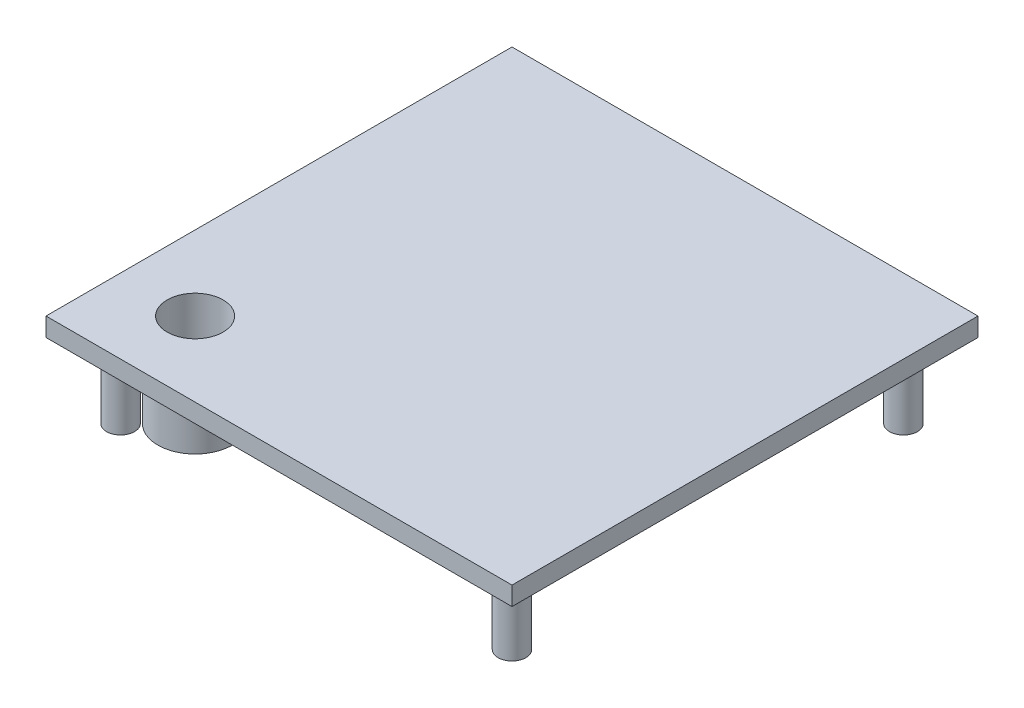
ISO-10303-21;
HEADER;
FILE_DESCRIPTION(('STEP AP214'),'2;1');
FILE_NAME('part.step','',(''),(''),'','','');
FILE_SCHEMA(('AUTOMOTIVE_DESIGN { 1 0 10303 214 1 1 1 1 }'));
ENDSEC;
DATA;
#1=APPLICATION_CONTEXT('core data for automotive mechanical design processes');
#2=APPLICATION_PROTOCOL_DEFINITION('international standard','automotive_design',2000,#1);
#3=PRODUCT_CONTEXT('',#1,'mechanical');
#4=PRODUCT('Part','Part','',(#3));
#5=PRODUCT_RELATED_PRODUCT_CATEGORY('part','',(#4));
#6=PRODUCT_DEFINITION_FORMATION('','',#4);
#7=PRODUCT_DEFINITION_CONTEXT('part definition',#1,'design');
#8=PRODUCT_DEFINITION('design','',#6,#7);
#9=PRODUCT_DEFINITION_SHAPE('','',#8);
#10=(LENGTH_UNIT() NAMED_UNIT(*) SI_UNIT(.MILLI.,.METRE.));
#11=(NAMED_UNIT(*) PLANE_ANGLE_UNIT() SI_UNIT($,.RADIAN.));
#12=(NAMED_UNIT(*) SI_UNIT($,.STERADIAN.) SOLID_ANGLE_UNIT());
#13=UNCERTAINTY_MEASURE_WITH_UNIT(LENGTH_MEASURE(1.E-05),#10,'distance_accuracy_value','');
#14=(GEOMETRIC_REPRESENTATION_CONTEXT(3) GLOBAL_UNCERTAINTY_ASSIGNED_CONTEXT((#13)) GLOBAL_UNIT_ASSIGNED_CONTEXT((#10,
#11,#12)) REPRESENTATION_CONTEXT('',''));
#15=CARTESIAN_POINT('',(0.,0.,0.));
#16=DIRECTION('',(0.,0.,1.));
#17=DIRECTION('',(1.,0.,0.));
#18=AXIS2_PLACEMENT_3D('',#15,#16,#17);
#19=CARTESIAN_POINT('',(0.,0.,0.));
#20=DIRECTION('',(0.,-1.,0.));
#21=DIRECTION('',(0.,0.,-1.));
#22=AXIS2_PLACEMENT_3D('',#19,#20,#21);
#23=PLANE('',#22);
#24=CARTESIAN_POINT('',(-21.,0.,-21.));
#25=DIRECTION('',(0.,-1.,0.));
#26=DIRECTION('',(0.,0.,-1.));
#27=AXIS2_PLACEMENT_3D('',#24,#25,#26);
#28=CIRCLE('',#27,1.5);
#29=CARTESIAN_POINT('',(-21.,0.,-22.5));
#30=VERTEX_POINT('',#29);
#31=EDGE_CURVE('E12',#30,#30,#28,.T.);
#32=ORIENTED_EDGE('',*,*,#31,.F.);
#33=EDGE_LOOP('',(#32));
#34=FACE_BOUND('',#33,.T.);
#35=CARTESIAN_POINT('',(21.,0.,-21.));
#36=DIRECTION('',(0.,-1.,0.));
#37=DIRECTION('',(0.,0.,-1.));
#38=AXIS2_PLACEMENT_3D('',#35,#36,#37);
#39=CIRCLE('',#38,1.5);
#40=CARTESIAN_POINT('',(21.,0.,-22.5));
#41=VERTEX_POINT('',#40);
#42=EDGE_CURVE('E57',#41,#41,#39,.T.);
#43=ORIENTED_EDGE('',*,*,#42,.F.);
#44=EDGE_LOOP('',(#43));
#45=FACE_BOUND('',#44,.T.);
#46=CARTESIAN_POINT('',(21.,0.,21.));
#47=DIRECTION('',(0.,-1.,0.));
#48=DIRECTION('',(0.,0.,-1.));
#49=AXIS2_PLACEMENT_3D('',#46,#47,#48);
#50=CIRCLE('',#49,1.5);
#51=CARTESIAN_POINT('',(21.,0.,19.5));
#52=VERTEX_POINT('',#51);
#53=EDGE_CURVE('E331',#52,#52,#50,.T.);
#54=ORIENTED_EDGE('',*,*,#53,.F.);
#55=EDGE_LOOP('',(#54));
#56=FACE_BOUND('',#55,.T.);
#57=CARTESIAN_POINT('',(-21.,0.,21.));
#58=DIRECTION('',(0.,-1.,0.));
#59=DIRECTION('',(0.,0.,-1.));
#60=AXIS2_PLACEMENT_3D('',#57,#58,#59);
#61=CIRCLE('',#60,1.5);
#62=CARTESIAN_POINT('',(-21.,0.,19.5));
#63=VERTEX_POINT('',#62);
#64=EDGE_CURVE('E327',#63,#63,#61,.T.);
#65=ORIENTED_EDGE('',*,*,#64,.F.);
#66=EDGE_LOOP('',(#65));
#67=FACE_BOUND('',#66,.T.);
#68=DIRECTION('',(0.,0.,-1.));
#69=VECTOR('',#68,1.);
#70=CARTESIAN_POINT('',(25.,0.,25.));
#71=LINE('',#70,#69);
#72=CARTESIAN_POINT('',(25.,0.,25.));
#73=VERTEX_POINT('',#72);
#74=CARTESIAN_POINT('',(25.,0.,-25.));
#75=VERTEX_POINT('',#74);
#76=EDGE_CURVE('E282',#73,#75,#71,.T.);
#77=ORIENTED_EDGE('',*,*,#76,.F.);
#78=DIRECTION('',(1.,0.,0.));
#79=VECTOR('',#78,1.);
#80=CARTESIAN_POINT('',(-25.,0.,25.));
#81=LINE('',#80,#79);
#82=CARTESIAN_POINT('',(-25.,0.,25.));
#83=VERTEX_POINT('',#82);
#84=EDGE_CURVE('E89',#83,#73,#81,.T.);
#85=ORIENTED_EDGE('',*,*,#84,.F.);
#86=DIRECTION('',(0.,0.,1.));
#87=VECTOR('',#86,1.);
#88=CARTESIAN_POINT('',(-25.,0.,25.));
#89=LINE('',#88,#87);
#90=CARTESIAN_POINT('',(-25.,0.,-25.));
#91=VERTEX_POINT('',#90);
#92=EDGE_CURVE('E83',#91,#83,#89,.T.);
#93=ORIENTED_EDGE('',*,*,#92,.F.);
#94=DIRECTION('',(-1.,0.,0.));
#95=VECTOR('',#94,1.);
#96=CARTESIAN_POINT('',(-25.,0.,-25.));
#97=LINE('',#96,#95);
#98=EDGE_CURVE('E297',#75,#91,#97,.T.);
#99=ORIENTED_EDGE('',*,*,#98,.F.);
#100=EDGE_LOOP('',(#77,#85,#93,#99));
#101=FACE_BOUND('',#100,.T.);
#102=DIRECTION('',(0.,0.,1.));
#103=VECTOR('',#102,1.);
#104=CARTESIAN_POINT('',(1.98725731266965,0.,-2.));
#105=LINE('',#104,#103);
#106=CARTESIAN_POINT('',(1.98725731266965,0.,-2.));
#107=VERTEX_POINT('',#106);
#108=CARTESIAN_POINT('',(1.98725731266965,0.,3.5));
#109=VERTEX_POINT('',#108);
#110=EDGE_CURVE('E556',#107,#109,#105,.T.);
#111=ORIENTED_EDGE('',*,*,#110,.T.);
#112=DIRECTION('',(-1.,0.,0.));
#113=VECTOR('',#112,1.);
#114=CARTESIAN_POINT('',(-1.13774268733035,0.,3.5));
#115=LINE('',#114,#113);
#116=CARTESIAN_POINT('',(-2.01274268733035,0.,3.5));
#117=VERTEX_POINT('',#116);
#118=EDGE_CURVE('E187',#109,#117,#115,.T.);
#119=ORIENTED_EDGE('',*,*,#118,.T.);
#120=DIRECTION('',(0.,0.,1.));
#121=VECTOR('',#120,1.);
#122=CARTESIAN_POINT('',(-2.01274268733035,0.,-2.));
#123=LINE('',#122,#121);
#124=CARTESIAN_POINT('',(-2.01274268733035,0.,-2.));
#125=VERTEX_POINT('',#124);
#126=EDGE_CURVE('E205',#125,#117,#123,.T.);
#127=ORIENTED_EDGE('',*,*,#126,.F.);
#128=DIRECTION('',(-1.,0.,0.));
#129=VECTOR('',#128,1.);
#130=CARTESIAN_POINT('',(-2.01274268733035,0.,-2.));
#131=LINE('',#130,#129);
#132=CARTESIAN_POINT('',(-3.,0.,-2.));
#133=VERTEX_POINT('',#132);
#134=EDGE_CURVE('E203',#125,#133,#131,.T.);
#135=ORIENTED_EDGE('',*,*,#134,.T.);
#136=DIRECTION('',(0.,0.,1.));
#137=VECTOR('',#136,1.);
#138=CARTESIAN_POINT('',(-3.,0.,-2.));
#139=LINE('',#138,#137);
#140=CARTESIAN_POINT('',(-3.,0.,5.5));
#141=VERTEX_POINT('',#140);
#142=EDGE_CURVE('E192',#133,#141,#139,.T.);
#143=ORIENTED_EDGE('',*,*,#142,.T.);
#144=DIRECTION('',(1.,0.,0.));
#145=VECTOR('',#144,1.);
#146=CARTESIAN_POINT('',(-2.01274268733035,0.,5.5));
#147=LINE('',#146,#145);
#148=CARTESIAN_POINT('',(2.98725731266965,0.,5.5));
#149=VERTEX_POINT('',#148);
#150=EDGE_CURVE('E172',#141,#149,#147,.T.);
#151=ORIENTED_EDGE('',*,*,#150,.T.);
#152=DIRECTION('',(0.,0.,1.));
#153=VECTOR('',#152,1.);
#154=CARTESIAN_POINT('',(2.98725731266965,0.,-2.));
#155=LINE('',#154,#153);
#156=CARTESIAN_POINT('',(2.98725731266965,0.,-2.));
#157=VERTEX_POINT('',#156);
#158=EDGE_CURVE('E559',#157,#149,#155,.T.);
#159=ORIENTED_EDGE('',*,*,#158,.F.);
#160=DIRECTION('',(-1.,0.,0.));
#161=VECTOR('',#160,1.);
#162=CARTESIAN_POINT('',(2.98725731266965,0.,-2.));
#163=LINE('',#162,#161);
#164=EDGE_CURVE('E546',#157,#107,#163,.T.);
#165=ORIENTED_EDGE('',*,*,#164,.T.);
#166=EDGE_LOOP('',(#111,#119,#127,#135,#143,#151,#159,#165));
#167=FACE_BOUND('',#166,.T.);
#168=CARTESIAN_POINT('',(-17.,0.,17.));
#169=DIRECTION('',(0.,-1.,0.));
#170=DIRECTION('',(0.,0.,-1.));
#171=AXIS2_PLACEMENT_3D('',#168,#169,#170);
#172=CIRCLE('',#171,4.);
#173=CARTESIAN_POINT('',(-17.,0.,13.));
#174=VERTEX_POINT('',#173);
#175=EDGE_CURVE('E514',#174,#174,#172,.T.);
#176=ORIENTED_EDGE('',*,*,#175,.F.);
#177=EDGE_LOOP('',(#176));
#178=FACE_BOUND('',#177,.T.);
#179=ADVANCED_FACE('F47',(#34,#45,#56,#67,#101,#167,#178),#23,.T.);
#180=CARTESIAN_POINT('',(-1.13774268733035,-10.4721359549996,3.5));
#181=DIRECTION('',(0.,0.,-1.));
#182=DIRECTION('',(-1.,0.,0.));
#183=AXIS2_PLACEMENT_3D('',#180,#181,#182);
#184=PLANE('',#183);
#185=DIRECTION('',(-1.,0.,0.));
#186=VECTOR('',#185,1.);
#187=CARTESIAN_POINT('',(-1.13774268733035,-2.99676892905057,3.5));
#188=LINE('',#187,#186);
#189=CARTESIAN_POINT('',(1.98725731266965,-2.99676892905057,3.5));
#190=VERTEX_POINT('',#189);
#191=CARTESIAN_POINT('',(-2.01274268733035,-2.99676892905057,3.5));
#192=VERTEX_POINT('',#191);
#193=EDGE_CURVE('E222',#190,#192,#188,.T.);
#194=ORIENTED_EDGE('',*,*,#193,.F.);
#195=DIRECTION('',(0.,1.,0.));
#196=VECTOR('',#195,1.);
#197=CARTESIAN_POINT('',(1.98725731266965,-10.4721359549996,3.5));
#198=LINE('',#197,#196);
#199=CARTESIAN_POINT('',(1.98725731266965,-3.,3.5));
#200=VERTEX_POINT('',#199);
#201=EDGE_CURVE('E278',#200,#190,#198,.T.);
#202=ORIENTED_EDGE('',*,*,#201,.F.);
#203=DIRECTION('',(-1.,0.,0.));
#204=VECTOR('',#203,1.);
#205=CARTESIAN_POINT('',(-1.13774268733035,-3.,3.5));
#206=LINE('',#205,#204);
#207=CARTESIAN_POINT('',(-2.01274268733035,-3.,3.5));
#208=VERTEX_POINT('',#207);
#209=EDGE_CURVE('E186',#200,#208,#206,.T.);
#210=ORIENTED_EDGE('',*,*,#209,.T.);
#211=DIRECTION('',(0.,1.,0.));
#212=VECTOR('',#211,1.);
#213=CARTESIAN_POINT('',(-2.01274268733035,-10.4721359549996,3.5));
#214=LINE('',#213,#212);
#215=EDGE_CURVE('E253',#208,#192,#214,.T.);
#216=ORIENTED_EDGE('',*,*,#215,.T.);
#217=EDGE_LOOP('',(#194,#202,#210,#216));
#218=FACE_BOUND('',#217,.T.);
#219=ADVANCED_FACE('F342',(#218),#184,.T.);
#220=CARTESIAN_POINT('',(-2.01274268733035,-10.4721359549996,3.5));
#221=DIRECTION('',(-1.,0.,0.));
#222=DIRECTION('',(0.,0.,1.));
#223=AXIS2_PLACEMENT_3D('',#220,#221,#222);
#224=PLANE('',#223);
#225=DIRECTION('',(0.,0.,1.));
#226=VECTOR('',#225,1.);
#227=CARTESIAN_POINT('',(-2.01274268733035,-2.99676892905057,3.5));
#228=LINE('',#227,#226);
#229=CARTESIAN_POINT('',(-2.01274268733035,-2.99676892905057,5.5));
#230=VERTEX_POINT('',#229);
#231=EDGE_CURVE('E226',#192,#230,#228,.T.);
#232=ORIENTED_EDGE('',*,*,#231,.F.);
#233=ORIENTED_EDGE('',*,*,#215,.F.);
#234=DIRECTION('',(0.,0.,1.));
#235=VECTOR('',#234,1.);
#236=CARTESIAN_POINT('',(-2.01274268733035,-3.,3.5));
#237=LINE('',#236,#235);
#238=CARTESIAN_POINT('',(-2.01274268733035,-3.,5.5));
#239=VERTEX_POINT('',#238);
#240=EDGE_CURVE('E265',#208,#239,#237,.T.);
#241=ORIENTED_EDGE('',*,*,#240,.T.);
#242=DIRECTION('',(0.,1.,0.));
#243=VECTOR('',#242,1.);
#244=CARTESIAN_POINT('',(-2.01274268733035,-10.4721359549996,5.5));
#245=LINE('',#244,#243);
#246=EDGE_CURVE('E264',#239,#230,#245,.T.);
#247=ORIENTED_EDGE('',*,*,#246,.T.);
#248=EDGE_LOOP('',(#232,#233,#241,#247));
#249=FACE_BOUND('',#248,.T.);
#250=ADVANCED_FACE('F379',(#249),#224,.T.);
#251=CARTESIAN_POINT('',(1.98725731266965,-10.4721359549996,3.5));
#252=DIRECTION('',(1.,0.,0.));
#253=DIRECTION('',(0.,0.,-1.));
#254=AXIS2_PLACEMENT_3D('',#251,#252,#253);
#255=PLANE('',#254);
#256=DIRECTION('',(0.,0.,-1.));
#257=VECTOR('',#256,1.);
#258=CARTESIAN_POINT('',(1.98725731266965,-2.99676892905057,3.5));
#259=LINE('',#258,#257);
#260=CARTESIAN_POINT('',(1.98725731266965,-2.99676892905057,5.5));
#261=VERTEX_POINT('',#260);
#262=EDGE_CURVE('E315',#261,#190,#259,.T.);
#263=ORIENTED_EDGE('',*,*,#262,.F.);
#264=DIRECTION('',(0.,1.,0.));
#265=VECTOR('',#264,1.);
#266=CARTESIAN_POINT('',(1.98725731266965,-10.4721359549996,5.5));
#267=LINE('',#266,#265);
#268=CARTESIAN_POINT('',(1.98725731266965,-3.,5.5));
#269=VERTEX_POINT('',#268);
#270=EDGE_CURVE('E259',#269,#261,#267,.T.);
#271=ORIENTED_EDGE('',*,*,#270,.F.);
#272=DIRECTION('',(0.,0.,-1.));
#273=VECTOR('',#272,1.);
#274=CARTESIAN_POINT('',(1.98725731266965,-3.,3.5));
#275=LINE('',#274,#273);
#276=EDGE_CURVE('E254',#269,#200,#275,.T.);
#277=ORIENTED_EDGE('',*,*,#276,.T.);
#278=ORIENTED_EDGE('',*,*,#201,.T.);
#279=EDGE_LOOP('',(#263,#271,#277,#278));
#280=FACE_BOUND('',#279,.T.);
#281=ADVANCED_FACE('F364',(#280),#255,.T.);
#282=CARTESIAN_POINT('',(25.,2.,25.));
#283=DIRECTION('',(-1.,0.,0.));
#284=DIRECTION('',(0.,0.,1.));
#285=AXIS2_PLACEMENT_3D('',#282,#283,#284);
#286=PLANE('',#285);
#287=ORIENTED_EDGE('',*,*,#76,.T.);
#288=DIRECTION('',(0.,-1.,0.));
#289=VECTOR('',#288,1.);
#290=CARTESIAN_POINT('',(25.,2.,-25.));
#291=LINE('',#290,#289);
#292=CARTESIAN_POINT('',(25.,2.,-25.));
#293=VERTEX_POINT('',#292);
#294=EDGE_CURVE('E312',#293,#75,#291,.T.);
#295=ORIENTED_EDGE('',*,*,#294,.F.);
#296=DIRECTION('',(0.,0.,-1.));
#297=VECTOR('',#296,1.);
#298=CARTESIAN_POINT('',(25.,2.,25.));
#299=LINE('',#298,#297);
#300=CARTESIAN_POINT('',(25.,2.,25.));
#301=VERTEX_POINT('',#300);
#302=EDGE_CURVE('E283',#301,#293,#299,.T.);
#303=ORIENTED_EDGE('',*,*,#302,.F.);
#304=DIRECTION('',(0.,-1.,0.));
#305=VECTOR('',#304,1.);
#306=CARTESIAN_POINT('',(25.,2.,25.));
#307=LINE('',#306,#305);
#308=EDGE_CURVE('E293',#301,#73,#307,.T.);
#309=ORIENTED_EDGE('',*,*,#308,.T.);
#310=EDGE_LOOP('',(#287,#295,#303,#309));
#311=FACE_BOUND('',#310,.T.);
#312=ADVANCED_FACE('F49',(#311),#286,.F.);
#313=CARTESIAN_POINT('',(-25.,2.,-25.));
#314=DIRECTION('',(0.,0.,1.));
#315=DIRECTION('',(1.,0.,0.));
#316=AXIS2_PLACEMENT_3D('',#313,#314,#315);
#317=PLANE('',#316);
#318=ORIENTED_EDGE('',*,*,#98,.T.);
#319=DIRECTION('',(0.,-1.,0.));
#320=VECTOR('',#319,1.);
#321=CARTESIAN_POINT('',(-25.,2.,-25.));
#322=LINE('',#321,#320);
#323=CARTESIAN_POINT('',(-25.,2.,-25.));
#324=VERTEX_POINT('',#323);
#325=EDGE_CURVE('E309',#324,#91,#322,.T.);
#326=ORIENTED_EDGE('',*,*,#325,.F.);
#327=DIRECTION('',(-1.,0.,0.));
#328=VECTOR('',#327,1.);
#329=CARTESIAN_POINT('',(-25.,2.,-25.));
#330=LINE('',#329,#328);
#331=EDGE_CURVE('E97',#293,#324,#330,.T.);
#332=ORIENTED_EDGE('',*,*,#331,.F.);
#333=ORIENTED_EDGE('',*,*,#294,.T.);
#334=EDGE_LOOP('',(#318,#326,#332,#333));
#335=FACE_BOUND('',#334,.T.);
#336=ADVANCED_FACE('F357',(#335),#317,.F.);
#337=CARTESIAN_POINT('',(-25.,2.,25.));
#338=DIRECTION('',(1.,0.,0.));
#339=DIRECTION('',(0.,0.,-1.));
#340=AXIS2_PLACEMENT_3D('',#337,#338,#339);
#341=PLANE('',#340);
#342=ORIENTED_EDGE('',*,*,#92,.T.);
#343=DIRECTION('',(0.,-1.,0.));
#344=VECTOR('',#343,1.);
#345=CARTESIAN_POINT('',(-25.,2.,25.));
#346=LINE('',#345,#344);
#347=CARTESIAN_POINT('',(-25.,2.,25.));
#348=VERTEX_POINT('',#347);
#349=EDGE_CURVE('E306',#348,#83,#346,.T.);
#350=ORIENTED_EDGE('',*,*,#349,.F.);
#351=DIRECTION('',(0.,0.,1.));
#352=VECTOR('',#351,1.);
#353=CARTESIAN_POINT('',(-25.,2.,25.));
#354=LINE('',#353,#352);
#355=EDGE_CURVE('E288',#324,#348,#354,.T.);
#356=ORIENTED_EDGE('',*,*,#355,.F.);
#357=ORIENTED_EDGE('',*,*,#325,.T.);
#358=EDGE_LOOP('',(#342,#350,#356,#357));
#359=FACE_BOUND('',#358,.T.);
#360=ADVANCED_FACE('F355',(#359),#341,.F.);
#361=CARTESIAN_POINT('',(-25.,2.,25.));
#362=DIRECTION('',(0.,0.,-1.));
#363=DIRECTION('',(-1.,0.,0.));
#364=AXIS2_PLACEMENT_3D('',#361,#362,#363);
#365=PLANE('',#364);
#366=ORIENTED_EDGE('',*,*,#84,.T.);
#367=ORIENTED_EDGE('',*,*,#308,.F.);
#368=DIRECTION('',(1.,0.,0.));
#369=VECTOR('',#368,1.);
#370=CARTESIAN_POINT('',(-25.,2.,25.));
#371=LINE('',#370,#369);
#372=EDGE_CURVE('E65',#348,#301,#371,.T.);
#373=ORIENTED_EDGE('',*,*,#372,.F.);
#374=ORIENTED_EDGE('',*,*,#349,.T.);
#375=EDGE_LOOP('',(#366,#367,#373,#374));
#376=FACE_BOUND('',#375,.T.);
#377=ADVANCED_FACE('F353',(#376),#365,.F.);
#378=CARTESIAN_POINT('',(0.,2.,0.));
#379=DIRECTION('',(0.,-1.,0.));
#380=DIRECTION('',(0.,0.,-1.));
#381=AXIS2_PLACEMENT_3D('',#378,#379,#380);
#382=PLANE('',#381);
#383=CARTESIAN_POINT('',(-17.,2.,17.));
#384=DIRECTION('',(0.,1.,0.));
#385=DIRECTION('',(0.,0.,1.));
#386=AXIS2_PLACEMENT_3D('',#383,#384,#385);
#387=CIRCLE('',#386,3.);
#388=CARTESIAN_POINT('',(-17.,2.,20.));
#389=VERTEX_POINT('',#388);
#390=EDGE_CURVE('E197',#389,#389,#387,.T.);
#391=ORIENTED_EDGE('',*,*,#390,.F.);
#392=EDGE_LOOP('',(#391));
#393=FACE_BOUND('',#392,.T.);
#394=ORIENTED_EDGE('',*,*,#302,.T.);
#395=ORIENTED_EDGE('',*,*,#331,.T.);
#396=ORIENTED_EDGE('',*,*,#355,.T.);
#397=ORIENTED_EDGE('',*,*,#372,.T.);
#398=EDGE_LOOP('',(#394,#395,#396,#397));
#399=FACE_BOUND('',#398,.T.);
#400=ADVANCED_FACE('F356',(#393,#399),#382,.F.);
#401=CARTESIAN_POINT('',(0.,-3.,0.));
#402=DIRECTION('',(0.,-1.,0.));
#403=DIRECTION('',(0.,0.,-1.));
#404=AXIS2_PLACEMENT_3D('',#401,#402,#403);
#405=PLANE('',#404);
#406=ORIENTED_EDGE('',*,*,#276,.F.);
#407=DIRECTION('',(1.,0.,0.));
#408=VECTOR('',#407,1.);
#409=CARTESIAN_POINT('',(-2.01274268733035,-3.,5.5));
#410=LINE('',#409,#408);
#411=EDGE_CURVE('E260',#239,#269,#410,.T.);
#412=ORIENTED_EDGE('',*,*,#411,.F.);
#413=ORIENTED_EDGE('',*,*,#240,.F.);
#414=ORIENTED_EDGE('',*,*,#209,.F.);
#415=EDGE_LOOP('',(#406,#412,#413,#414));
#416=FACE_BOUND('',#415,.T.);
#417=ADVANCED_FACE('F370',(#416),#405,.T.);
#418=DIRECTION('',(1.,0.,0.));
#419=VECTOR('',#418,1.);
#420=CARTESIAN_POINT('',(-1.13774268733035,-2.,3.5));
#421=LINE('',#420,#419);
#422=CARTESIAN_POINT('',(-2.01274268733035,-2.,3.5));
#423=VERTEX_POINT('',#422);
#424=CARTESIAN_POINT('',(1.98725731266965,-2.,3.5));
#425=VERTEX_POINT('',#424);
#426=EDGE_CURVE('E219',#423,#425,#421,.T.);
#427=ORIENTED_EDGE('',*,*,#426,.F.);
#428=DIRECTION('',(0.,-1.,0.));
#429=VECTOR('',#428,1.);
#430=CARTESIAN_POINT('',(-2.01274268733035,-10.4721359549996,3.5));
#431=LINE('',#430,#429);
#432=EDGE_CURVE('E229',#117,#423,#431,.T.);
#433=ORIENTED_EDGE('',*,*,#432,.F.);
#434=ORIENTED_EDGE('',*,*,#118,.F.);
#435=EDGE_CURVE('E258',#425,#109,#198,.T.);
#436=ORIENTED_EDGE('',*,*,#435,.F.);
#437=EDGE_LOOP('',(#427,#433,#434,#436));
#438=FACE_BOUND('',#437,.T.);
#439=CARTESIAN_POINT('',(0.995752475872839,-0.999990979228708,3.5));
#440=DIRECTION('',(0.,0.,-1.));
#441=DIRECTION('',(-1.,0.,0.));
#442=AXIS2_PLACEMENT_3D('',#439,#440,#441);
#443=CIRCLE('',#442,0.25);
#444=CARTESIAN_POINT('',(0.745752475872839,-0.999990979228708,3.5));
#445=VERTEX_POINT('',#444);
#446=EDGE_CURVE('E243',#445,#445,#443,.F.);
#447=ORIENTED_EDGE('',*,*,#446,.T.);
#448=EDGE_LOOP('',(#447));
#449=FACE_BOUND('',#448,.T.);
#450=CARTESIAN_POINT('',(-1.00424752412716,-0.999990979228708,3.5));
#451=DIRECTION('',(0.,0.,-1.));
#452=DIRECTION('',(-1.,0.,0.));
#453=AXIS2_PLACEMENT_3D('',#450,#451,#452);
#454=CIRCLE('',#453,0.25);
#455=CARTESIAN_POINT('',(-1.25424752412716,-0.999990979228708,3.5));
#456=VERTEX_POINT('',#455);
#457=EDGE_CURVE('E238',#456,#456,#454,.F.);
#458=ORIENTED_EDGE('',*,*,#457,.T.);
#459=EDGE_LOOP('',(#458));
#460=FACE_BOUND('',#459,.T.);
#461=CARTESIAN_POINT('',(-0.00424752412716145,-0.999990979228707,3.5));
#462=DIRECTION('',(0.,0.,-1.));
#463=DIRECTION('',(-1.,0.,0.));
#464=AXIS2_PLACEMENT_3D('',#461,#462,#463);
#465=CIRCLE('',#464,0.25);
#466=CARTESIAN_POINT('',(-0.254247524127161,-0.999990979228707,3.5));
#467=VERTEX_POINT('',#466);
#468=EDGE_CURVE('E233',#467,#467,#465,.F.);
#469=ORIENTED_EDGE('',*,*,#468,.T.);
#470=EDGE_LOOP('',(#469));
#471=FACE_BOUND('',#470,.T.);
#472=ADVANCED_FACE('F374',(#438,#449,#460,#471),#184,.T.);
#473=CARTESIAN_POINT('',(-2.01274268733035,-10.4721359549996,5.5));
#474=DIRECTION('',(0.,0.,1.));
#475=DIRECTION('',(1.,0.,0.));
#476=AXIS2_PLACEMENT_3D('',#473,#474,#475);
#477=PLANE('',#476);
#478=ORIENTED_EDGE('',*,*,#150,.F.);
#479=DIRECTION('',(0.,-1.,0.));
#480=VECTOR('',#479,1.);
#481=CARTESIAN_POINT('',(-3.,-2.99676892905057,5.5));
#482=LINE('',#481,#480);
#483=CARTESIAN_POINT('',(-3.,-2.99676892905057,5.5));
#484=VERTEX_POINT('',#483);
#485=EDGE_CURVE('E177',#141,#484,#482,.T.);
#486=ORIENTED_EDGE('',*,*,#485,.T.);
#487=DIRECTION('',(1.,0.,0.));
#488=VECTOR('',#487,1.);
#489=CARTESIAN_POINT('',(-3.,-2.99676892905057,5.5));
#490=LINE('',#489,#488);
#491=EDGE_CURVE('E521',#484,#230,#490,.T.);
#492=ORIENTED_EDGE('',*,*,#491,.T.);
#493=ORIENTED_EDGE('',*,*,#246,.F.);
#494=ORIENTED_EDGE('',*,*,#411,.T.);
#495=ORIENTED_EDGE('',*,*,#270,.T.);
#496=CARTESIAN_POINT('',(2.98725731266965,-2.99676892905057,5.5));
#497=VERTEX_POINT('',#496);
#498=EDGE_CURVE('E196',#261,#497,#490,.T.);
#499=ORIENTED_EDGE('',*,*,#498,.T.);
#500=DIRECTION('',(0.,1.,0.));
#501=VECTOR('',#500,1.);
#502=CARTESIAN_POINT('',(2.98725731266965,-2.99676892905057,5.5));
#503=LINE('',#502,#501);
#504=EDGE_CURVE('E180',#497,#149,#503,.T.);
#505=ORIENTED_EDGE('',*,*,#504,.T.);
#506=EDGE_LOOP('',(#478,#486,#492,#493,#494,#495,#499,#505));
#507=FACE_BOUND('',#506,.T.);
#508=CARTESIAN_POINT('',(0.995752475872839,-0.999990979228708,5.5));
#509=DIRECTION('',(0.,0.,1.));
#510=DIRECTION('',(1.,0.,0.));
#511=AXIS2_PLACEMENT_3D('',#508,#509,#510);
#512=CIRCLE('',#511,0.25);
#513=CARTESIAN_POINT('',(1.24575247587284,-0.999990979228708,5.5));
#514=VERTEX_POINT('',#513);
#515=EDGE_CURVE('E242',#514,#514,#512,.F.);
#516=ORIENTED_EDGE('',*,*,#515,.T.);
#517=EDGE_LOOP('',(#516));
#518=FACE_BOUND('',#517,.T.);
#519=CARTESIAN_POINT('',(-1.00424752412716,-0.999990979228708,5.5));
#520=DIRECTION('',(0.,0.,1.));
#521=DIRECTION('',(1.,0.,0.));
#522=AXIS2_PLACEMENT_3D('',#519,#520,#521);
#523=CIRCLE('',#522,0.25);
#524=CARTESIAN_POINT('',(-0.754247524127161,-0.999990979228708,5.5));
#525=VERTEX_POINT('',#524);
#526=EDGE_CURVE('E237',#525,#525,#523,.F.);
#527=ORIENTED_EDGE('',*,*,#526,.T.);
#528=EDGE_LOOP('',(#527));
#529=FACE_BOUND('',#528,.T.);
#530=CARTESIAN_POINT('',(-0.00424752412716145,-0.999990979228707,5.5));
#531=DIRECTION('',(0.,0.,1.));
#532=DIRECTION('',(1.,0.,0.));
#533=AXIS2_PLACEMENT_3D('',#530,#531,#532);
#534=CIRCLE('',#533,0.25);
#535=CARTESIAN_POINT('',(0.245752475872839,-0.999990979228707,5.5));
#536=VERTEX_POINT('',#535);
#537=EDGE_CURVE('E232',#536,#536,#534,.F.);
#538=ORIENTED_EDGE('',*,*,#537,.T.);
#539=EDGE_LOOP('',(#538));
#540=FACE_BOUND('',#539,.T.);
#541=ADVANCED_FACE('F174',(#507,#518,#529,#540),#477,.T.);
#542=CARTESIAN_POINT('',(-0.00424752412716145,-0.999990979228707,10.));
#543=DIRECTION('',(0.,0.,-1.));
#544=DIRECTION('',(-1.,0.,0.));
#545=AXIS2_PLACEMENT_3D('',#542,#543,#544);
#546=CYLINDRICAL_SURFACE('',#545,0.25);
#547=ORIENTED_EDGE('',*,*,#468,.F.);
#548=EDGE_LOOP('',(#547));
#549=FACE_BOUND('',#548,.T.);
#550=ORIENTED_EDGE('',*,*,#537,.F.);
#551=EDGE_LOOP('',(#550));
#552=FACE_BOUND('',#551,.T.);
#553=ADVANCED_FACE('F385',(#549,#552),#546,.F.);
#554=CARTESIAN_POINT('',(-1.00424752412716,-0.999990979228708,10.));
#555=DIRECTION('',(0.,0.,-1.));
#556=DIRECTION('',(-1.,0.,0.));
#557=AXIS2_PLACEMENT_3D('',#554,#555,#556);
#558=CYLINDRICAL_SURFACE('',#557,0.25);
#559=ORIENTED_EDGE('',*,*,#457,.F.);
#560=EDGE_LOOP('',(#559));
#561=FACE_BOUND('',#560,.T.);
#562=ORIENTED_EDGE('',*,*,#526,.F.);
#563=EDGE_LOOP('',(#562));
#564=FACE_BOUND('',#563,.T.);
#565=ADVANCED_FACE('F391',(#561,#564),#558,.F.);
#566=CARTESIAN_POINT('',(0.995752475872839,-0.999990979228708,10.));
#567=DIRECTION('',(0.,0.,-1.));
#568=DIRECTION('',(-1.,0.,0.));
#569=AXIS2_PLACEMENT_3D('',#566,#567,#568);
#570=CYLINDRICAL_SURFACE('',#569,0.25);
#571=ORIENTED_EDGE('',*,*,#446,.F.);
#572=EDGE_LOOP('',(#571));
#573=FACE_BOUND('',#572,.T.);
#574=ORIENTED_EDGE('',*,*,#515,.F.);
#575=EDGE_LOOP('',(#574));
#576=FACE_BOUND('',#575,.T.);
#577=ADVANCED_FACE('F393',(#573,#576),#570,.F.);
#578=CARTESIAN_POINT('',(1.98725731266965,-2.,-2.));
#579=DIRECTION('',(-1.,0.,0.));
#580=DIRECTION('',(0.,-1.,0.));
#581=AXIS2_PLACEMENT_3D('',#578,#579,#580);
#582=PLANE('',#581);
#583=DIRECTION('',(0.,0.,1.));
#584=VECTOR('',#583,1.);
#585=CARTESIAN_POINT('',(1.98725731266965,-2.,-2.));
#586=LINE('',#585,#584);
#587=CARTESIAN_POINT('',(1.98725731266965,-2.,-2.));
#588=VERTEX_POINT('',#587);
#589=EDGE_CURVE('E223',#588,#425,#586,.T.);
#590=ORIENTED_EDGE('',*,*,#589,.T.);
#591=ORIENTED_EDGE('',*,*,#435,.T.);
#592=ORIENTED_EDGE('',*,*,#110,.F.);
#593=DIRECTION('',(0.,-1.,0.));
#594=VECTOR('',#593,1.);
#595=CARTESIAN_POINT('',(1.98725731266965,-2.,-2.));
#596=LINE('',#595,#594);
#597=EDGE_CURVE('E218',#107,#588,#596,.T.);
#598=ORIENTED_EDGE('',*,*,#597,.T.);
#599=EDGE_LOOP('',(#590,#591,#592,#598));
#600=FACE_BOUND('',#599,.T.);
#601=ADVANCED_FACE('F396',(#600),#582,.T.);
#602=CARTESIAN_POINT('',(2.98725731266965,-2.99676892905057,-2.));
#603=DIRECTION('',(1.,0.,0.));
#604=DIRECTION('',(0.,0.,-1.));
#605=AXIS2_PLACEMENT_3D('',#602,#603,#604);
#606=PLANE('',#605);
#607=ORIENTED_EDGE('',*,*,#158,.T.);
#608=ORIENTED_EDGE('',*,*,#504,.F.);
#609=DIRECTION('',(0.,0.,1.));
#610=VECTOR('',#609,1.);
#611=CARTESIAN_POINT('',(2.98725731266965,-2.99676892905057,-2.));
#612=LINE('',#611,#610);
#613=CARTESIAN_POINT('',(2.98725731266965,-2.99676892905057,-2.));
#614=VERTEX_POINT('',#613);
#615=EDGE_CURVE('E209',#614,#497,#612,.T.);
#616=ORIENTED_EDGE('',*,*,#615,.F.);
#617=DIRECTION('',(0.,1.,0.));
#618=VECTOR('',#617,1.);
#619=CARTESIAN_POINT('',(2.98725731266965,-2.99676892905057,-2.));
#620=LINE('',#619,#618);
#621=EDGE_CURVE('E542',#614,#157,#620,.T.);
#622=ORIENTED_EDGE('',*,*,#621,.T.);
#623=EDGE_LOOP('',(#607,#608,#616,#622));
#624=FACE_BOUND('',#623,.T.);
#625=ADVANCED_FACE('F415',(#624),#606,.T.);
#626=CARTESIAN_POINT('',(-3.,-2.99676892905057,-2.));
#627=DIRECTION('',(0.,-1.,0.));
#628=DIRECTION('',(0.,0.,-1.));
#629=AXIS2_PLACEMENT_3D('',#626,#627,#628);
#630=PLANE('',#629);
#631=ORIENTED_EDGE('',*,*,#193,.T.);
#632=ORIENTED_EDGE('',*,*,#231,.T.);
#633=ORIENTED_EDGE('',*,*,#491,.F.);
#634=DIRECTION('',(0.,0.,1.));
#635=VECTOR('',#634,1.);
#636=CARTESIAN_POINT('',(-3.,-2.99676892905057,-2.));
#637=LINE('',#636,#635);
#638=CARTESIAN_POINT('',(-3.,-2.99676892905057,-2.));
#639=VERTEX_POINT('',#638);
#640=EDGE_CURVE('E194',#639,#484,#637,.T.);
#641=ORIENTED_EDGE('',*,*,#640,.F.);
#642=DIRECTION('',(1.,0.,0.));
#643=VECTOR('',#642,1.);
#644=CARTESIAN_POINT('',(-3.,-2.99676892905057,-2.));
#645=LINE('',#644,#643);
#646=EDGE_CURVE('E538',#639,#614,#645,.T.);
#647=ORIENTED_EDGE('',*,*,#646,.T.);
#648=ORIENTED_EDGE('',*,*,#615,.T.);
#649=ORIENTED_EDGE('',*,*,#498,.F.);
#650=ORIENTED_EDGE('',*,*,#262,.T.);
#651=EDGE_LOOP('',(#631,#632,#633,#641,#647,#648,#649,#650));
#652=FACE_BOUND('',#651,.T.);
#653=ADVANCED_FACE('F412',(#652),#630,.T.);
#654=CARTESIAN_POINT('',(-3.,-2.99676892905057,-2.));
#655=DIRECTION('',(-1.,0.,0.));
#656=DIRECTION('',(0.,0.,1.));
#657=AXIS2_PLACEMENT_3D('',#654,#655,#656);
#658=PLANE('',#657);
#659=ORIENTED_EDGE('',*,*,#640,.T.);
#660=ORIENTED_EDGE('',*,*,#485,.F.);
#661=ORIENTED_EDGE('',*,*,#142,.F.);
#662=DIRECTION('',(0.,-1.,0.));
#663=VECTOR('',#662,1.);
#664=CARTESIAN_POINT('',(-3.,-2.99676892905057,-2.));
#665=LINE('',#664,#663);
#666=EDGE_CURVE('E535',#133,#639,#665,.T.);
#667=ORIENTED_EDGE('',*,*,#666,.T.);
#668=EDGE_LOOP('',(#659,#660,#661,#667));
#669=FACE_BOUND('',#668,.T.);
#670=ADVANCED_FACE('F190',(#669),#658,.T.);
#671=CARTESIAN_POINT('',(-2.01274268733035,-2.,-2.));
#672=DIRECTION('',(1.,0.,0.));
#673=DIRECTION('',(0.,0.,-1.));
#674=AXIS2_PLACEMENT_3D('',#671,#672,#673);
#675=PLANE('',#674);
#676=ORIENTED_EDGE('',*,*,#126,.T.);
#677=ORIENTED_EDGE('',*,*,#432,.T.);
#678=DIRECTION('',(0.,0.,1.));
#679=VECTOR('',#678,1.);
#680=CARTESIAN_POINT('',(-2.01274268733035,-2.,-2.));
#681=LINE('',#680,#679);
#682=CARTESIAN_POINT('',(-2.01274268733035,-2.,-2.));
#683=VERTEX_POINT('',#682);
#684=EDGE_CURVE('E211',#683,#423,#681,.T.);
#685=ORIENTED_EDGE('',*,*,#684,.F.);
#686=DIRECTION('',(0.,1.,0.));
#687=VECTOR('',#686,1.);
#688=CARTESIAN_POINT('',(-2.01274268733035,-2.,-2.));
#689=LINE('',#688,#687);
#690=EDGE_CURVE('E529',#683,#125,#689,.T.);
#691=ORIENTED_EDGE('',*,*,#690,.T.);
#692=EDGE_LOOP('',(#676,#677,#685,#691));
#693=FACE_BOUND('',#692,.T.);
#694=ADVANCED_FACE('F405',(#693),#675,.T.);
#695=CARTESIAN_POINT('',(-0.00637134366517642,-2.,-2.));
#696=DIRECTION('',(0.,1.,0.));
#697=DIRECTION('',(0.,0.,1.));
#698=AXIS2_PLACEMENT_3D('',#695,#696,#697);
#699=PLANE('',#698);
#700=ORIENTED_EDGE('',*,*,#684,.T.);
#701=ORIENTED_EDGE('',*,*,#426,.T.);
#702=ORIENTED_EDGE('',*,*,#589,.F.);
#703=DIRECTION('',(-1.,0.,0.));
#704=VECTOR('',#703,1.);
#705=CARTESIAN_POINT('',(-0.00637134366517642,-2.,-2.));
#706=LINE('',#705,#704);
#707=EDGE_CURVE('E526',#588,#683,#706,.T.);
#708=ORIENTED_EDGE('',*,*,#707,.T.);
#709=EDGE_LOOP('',(#700,#701,#702,#708));
#710=FACE_BOUND('',#709,.T.);
#711=ADVANCED_FACE('F401',(#710),#699,.T.);
#712=CARTESIAN_POINT('',(0.,0.,-2.));
#713=DIRECTION('',(0.,0.,1.));
#714=DIRECTION('',(1.,0.,0.));
#715=AXIS2_PLACEMENT_3D('',#712,#713,#714);
#716=PLANE('',#715);
#717=ORIENTED_EDGE('',*,*,#707,.F.);
#718=ORIENTED_EDGE('',*,*,#597,.F.);
#719=ORIENTED_EDGE('',*,*,#164,.F.);
#720=ORIENTED_EDGE('',*,*,#621,.F.);
#721=ORIENTED_EDGE('',*,*,#646,.F.);
#722=ORIENTED_EDGE('',*,*,#666,.F.);
#723=ORIENTED_EDGE('',*,*,#134,.F.);
#724=ORIENTED_EDGE('',*,*,#690,.F.);
#725=EDGE_LOOP('',(#717,#718,#719,#720,#721,#722,#723,#724));
#726=FACE_BOUND('',#725,.T.);
#727=ADVANCED_FACE('F404',(#726),#716,.F.);
#728=CARTESIAN_POINT('',(-17.,2.,17.));
#729=DIRECTION('',(0.,-1.,0.));
#730=DIRECTION('',(0.,0.,-1.));
#731=AXIS2_PLACEMENT_3D('',#728,#729,#730);
#732=CYLINDRICAL_SURFACE('',#731,3.);
#733=ORIENTED_EDGE('',*,*,#390,.T.);
#734=EDGE_LOOP('',(#733));
#735=FACE_BOUND('',#734,.T.);
#736=CARTESIAN_POINT('',(-17.,-7.,17.));
#737=DIRECTION('',(0.,-1.,0.));
#738=DIRECTION('',(0.,0.,-1.));
#739=AXIS2_PLACEMENT_3D('',#736,#737,#738);
#740=CIRCLE('',#739,3.);
#741=CARTESIAN_POINT('',(-17.,-7.,14.));
#742=VERTEX_POINT('',#741);
#743=EDGE_CURVE('E510',#742,#742,#740,.T.);
#744=ORIENTED_EDGE('',*,*,#743,.T.);
#745=EDGE_LOOP('',(#744));
#746=FACE_BOUND('',#745,.T.);
#747=ADVANCED_FACE('F425',(#735,#746),#732,.F.);
#748=CARTESIAN_POINT('',(-17.,-7.,17.));
#749=DIRECTION('',(0.,1.,0.));
#750=DIRECTION('',(0.,0.,1.));
#751=AXIS2_PLACEMENT_3D('',#748,#749,#750);
#752=CYLINDRICAL_SURFACE('',#751,4.);
#753=ORIENTED_EDGE('',*,*,#175,.T.);
#754=EDGE_LOOP('',(#753));
#755=FACE_BOUND('',#754,.T.);
#756=CARTESIAN_POINT('',(-17.,-8.,17.));
#757=DIRECTION('',(0.,-1.,0.));
#758=DIRECTION('',(0.,0.,-1.));
#759=AXIS2_PLACEMENT_3D('',#756,#757,#758);
#760=CIRCLE('',#759,4.);
#761=CARTESIAN_POINT('',(-17.,-8.,13.));
#762=VERTEX_POINT('',#761);
#763=EDGE_CURVE('E503',#762,#762,#760,.T.);
#764=ORIENTED_EDGE('',*,*,#763,.F.);
#765=EDGE_LOOP('',(#764));
#766=FACE_BOUND('',#765,.T.);
#767=ADVANCED_FACE('F429',(#755,#766),#752,.T.);
#768=CARTESIAN_POINT('',(-17.,-7.,17.));
#769=DIRECTION('',(0.,-1.,0.));
#770=DIRECTION('',(0.,0.,-1.));
#771=AXIS2_PLACEMENT_3D('',#768,#769,#770);
#772=PLANE('',#771);
#773=CARTESIAN_POINT('',(-17.,-7.,17.));
#774=DIRECTION('',(0.,-1.,0.));
#775=DIRECTION('',(0.,0.,-1.));
#776=AXIS2_PLACEMENT_3D('',#773,#774,#775);
#777=CIRCLE('',#776,2.5);
#778=CARTESIAN_POINT('',(-17.,-7.,14.5));
#779=VERTEX_POINT('',#778);
#780=EDGE_CURVE('E498',#779,#779,#777,.T.);
#781=ORIENTED_EDGE('',*,*,#780,.T.);
#782=EDGE_LOOP('',(#781));
#783=FACE_BOUND('',#782,.T.);
#784=ORIENTED_EDGE('',*,*,#743,.F.);
#785=EDGE_LOOP('',(#784));
#786=FACE_BOUND('',#785,.T.);
#787=ADVANCED_FACE('F433',(#783,#786),#772,.F.);
#788=CARTESIAN_POINT('',(-17.,-8.,17.));
#789=DIRECTION('',(0.,-1.,0.));
#790=DIRECTION('',(0.,0.,-1.));
#791=AXIS2_PLACEMENT_3D('',#788,#789,#790);
#792=PLANE('',#791);
#793=ORIENTED_EDGE('',*,*,#763,.T.);
#794=EDGE_LOOP('',(#793));
#795=FACE_BOUND('',#794,.T.);
#796=CARTESIAN_POINT('',(-17.,-8.,17.));
#797=DIRECTION('',(0.,-1.,0.));
#798=DIRECTION('',(0.,0.,-1.));
#799=AXIS2_PLACEMENT_3D('',#796,#797,#798);
#800=CIRCLE('',#799,2.5);
#801=CARTESIAN_POINT('',(-17.,-8.,14.5));
#802=VERTEX_POINT('',#801);
#803=EDGE_CURVE('E499',#802,#802,#800,.T.);
#804=ORIENTED_EDGE('',*,*,#803,.F.);
#805=EDGE_LOOP('',(#804));
#806=FACE_BOUND('',#805,.T.);
#807=ADVANCED_FACE('F437',(#795,#806),#792,.T.);
#808=CARTESIAN_POINT('',(-17.,-8.,17.));
#809=DIRECTION('',(0.,1.,0.));
#810=DIRECTION('',(0.,0.,1.));
#811=AXIS2_PLACEMENT_3D('',#808,#809,#810);
#812=CYLINDRICAL_SURFACE('',#811,2.5);
#813=ORIENTED_EDGE('',*,*,#803,.T.);
#814=EDGE_LOOP('',(#813));
#815=FACE_BOUND('',#814,.T.);
#816=ORIENTED_EDGE('',*,*,#780,.F.);
#817=EDGE_LOOP('',(#816));
#818=FACE_BOUND('',#817,.T.);
#819=ADVANCED_FACE('F441',(#815,#818),#812,.F.);
#820=CARTESIAN_POINT('',(-21.,-8.,21.));
#821=DIRECTION('',(0.,1.,0.));
#822=DIRECTION('',(0.,0.,1.));
#823=AXIS2_PLACEMENT_3D('',#820,#821,#822);
#824=CYLINDRICAL_SURFACE('',#823,1.5);
#825=CARTESIAN_POINT('',(-21.,-8.,21.));
#826=DIRECTION('',(0.,1.,0.));
#827=DIRECTION('',(0.,0.,1.));
#828=AXIS2_PLACEMENT_3D('',#825,#826,#827);
#829=CIRCLE('',#828,1.5);
#830=CARTESIAN_POINT('',(-21.,-8.,22.5));
#831=VERTEX_POINT('',#830);
#832=EDGE_CURVE('E494',#831,#831,#829,.T.);
#833=ORIENTED_EDGE('',*,*,#832,.T.);
#834=EDGE_LOOP('',(#833));
#835=FACE_BOUND('',#834,.T.);
#836=ORIENTED_EDGE('',*,*,#64,.T.);
#837=EDGE_LOOP('',(#836));
#838=FACE_BOUND('',#837,.T.);
#839=ADVANCED_FACE('F445',(#835,#838),#824,.T.);
#840=CARTESIAN_POINT('',(-21.,-8.,21.));
#841=DIRECTION('',(0.,1.,0.));
#842=DIRECTION('',(0.,0.,1.));
#843=AXIS2_PLACEMENT_3D('',#840,#841,#842);
#844=PLANE('',#843);
#845=ORIENTED_EDGE('',*,*,#832,.F.);
#846=EDGE_LOOP('',(#845));
#847=FACE_BOUND('',#846,.T.);
#848=ADVANCED_FACE('F449',(#847),#844,.F.);
#849=CARTESIAN_POINT('',(21.,-8.,21.));
#850=DIRECTION('',(0.,1.,0.));
#851=DIRECTION('',(0.,0.,1.));
#852=AXIS2_PLACEMENT_3D('',#849,#850,#851);
#853=CYLINDRICAL_SURFACE('',#852,1.5);
#854=CARTESIAN_POINT('',(21.,-8.,21.));
#855=DIRECTION('',(0.,1.,0.));
#856=DIRECTION('',(0.,0.,-1.));
#857=AXIS2_PLACEMENT_3D('',#854,#855,#856);
#858=CIRCLE('',#857,1.5);
#859=CARTESIAN_POINT('',(21.,-8.,19.5));
#860=VERTEX_POINT('',#859);
#861=EDGE_CURVE('E488',#860,#860,#858,.T.);
#862=ORIENTED_EDGE('',*,*,#861,.T.);
#863=EDGE_LOOP('',(#862));
#864=FACE_BOUND('',#863,.T.);
#865=ORIENTED_EDGE('',*,*,#53,.T.);
#866=EDGE_LOOP('',(#865));
#867=FACE_BOUND('',#866,.T.);
#868=ADVANCED_FACE('F453',(#864,#867),#853,.T.);
#869=CARTESIAN_POINT('',(21.,-8.,21.));
#870=DIRECTION('',(0.,-1.,0.));
#871=DIRECTION('',(0.,0.,-1.));
#872=AXIS2_PLACEMENT_3D('',#869,#870,#871);
#873=PLANE('',#872);
#874=ORIENTED_EDGE('',*,*,#861,.F.);
#875=EDGE_LOOP('',(#874));
#876=FACE_BOUND('',#875,.T.);
#877=ADVANCED_FACE('F455',(#876),#873,.T.);
#878=CARTESIAN_POINT('',(21.,-8.,-21.));
#879=DIRECTION('',(0.,1.,0.));
#880=DIRECTION('',(0.,0.,1.));
#881=AXIS2_PLACEMENT_3D('',#878,#879,#880);
#882=CYLINDRICAL_SURFACE('',#881,1.5);
#883=CARTESIAN_POINT('',(21.,-8.,-21.));
#884=DIRECTION('',(0.,1.,0.));
#885=DIRECTION('',(0.,0.,1.));
#886=AXIS2_PLACEMENT_3D('',#883,#884,#885);
#887=CIRCLE('',#886,1.5);
#888=CARTESIAN_POINT('',(21.,-8.,-19.5));
#889=VERTEX_POINT('',#888);
#890=EDGE_CURVE('E484',#889,#889,#887,.T.);
#891=ORIENTED_EDGE('',*,*,#890,.T.);
#892=EDGE_LOOP('',(#891));
#893=FACE_BOUND('',#892,.T.);
#894=ORIENTED_EDGE('',*,*,#42,.T.);
#895=EDGE_LOOP('',(#894));
#896=FACE_BOUND('',#895,.T.);
#897=ADVANCED_FACE('F338',(#893,#896),#882,.T.);
#898=CARTESIAN_POINT('',(21.,-8.,-21.));
#899=DIRECTION('',(0.,1.,0.));
#900=DIRECTION('',(0.,0.,1.));
#901=AXIS2_PLACEMENT_3D('',#898,#899,#900);
#902=PLANE('',#901);
#903=ORIENTED_EDGE('',*,*,#890,.F.);
#904=EDGE_LOOP('',(#903));
#905=FACE_BOUND('',#904,.T.);
#906=ADVANCED_FACE('F462',(#905),#902,.F.);
#907=CARTESIAN_POINT('',(-21.,-8.,-21.));
#908=DIRECTION('',(0.,1.,0.));
#909=DIRECTION('',(0.,0.,1.));
#910=AXIS2_PLACEMENT_3D('',#907,#908,#909);
#911=CYLINDRICAL_SURFACE('',#910,1.5);
#912=CARTESIAN_POINT('',(-21.,-8.,-21.));
#913=DIRECTION('',(0.,1.,0.));
#914=DIRECTION('',(0.,0.,-1.));
#915=AXIS2_PLACEMENT_3D('',#912,#913,#914);
#916=CIRCLE('',#915,1.5);
#917=CARTESIAN_POINT('',(-21.,-8.,-22.5));
#918=VERTEX_POINT('',#917);
#919=EDGE_CURVE('E481',#918,#918,#916,.T.);
#920=ORIENTED_EDGE('',*,*,#919,.T.);
#921=EDGE_LOOP('',(#920));
#922=FACE_BOUND('',#921,.T.);
#923=ORIENTED_EDGE('',*,*,#31,.T.);
#924=EDGE_LOOP('',(#923));
#925=FACE_BOUND('',#924,.T.);
#926=ADVANCED_FACE('F465',(#922,#925),#911,.T.);
#927=CARTESIAN_POINT('',(-21.,-8.,-21.));
#928=DIRECTION('',(0.,-1.,0.));
#929=DIRECTION('',(0.,0.,-1.));
#930=AXIS2_PLACEMENT_3D('',#927,#928,#929);
#931=PLANE('',#930);
#932=ORIENTED_EDGE('',*,*,#919,.F.);
#933=EDGE_LOOP('',(#932));
#934=FACE_BOUND('',#933,.T.);
#935=ADVANCED_FACE('F470',(#934),#931,.T.);
#936=CLOSED_SHELL('',(#179,#219,#250,#281,#312,#336,#360,#377,#400,#417,#472,#541,#553,#565,
#577,#601,#625,#653,#670,#694,#711,#727,#747,#767,#787,#807,#819,#839,#848,#868,#877,#897,#906,
#926,#935));
#937=MANIFOLD_SOLID_BREP('B2',#936);
#938=ADVANCED_BREP_SHAPE_REPRESENTATION('',(#18,#937),#14);
#939=SHAPE_DEFINITION_REPRESENTATION(#9,#938);
ENDSEC;
END-ISO-10303-21;
